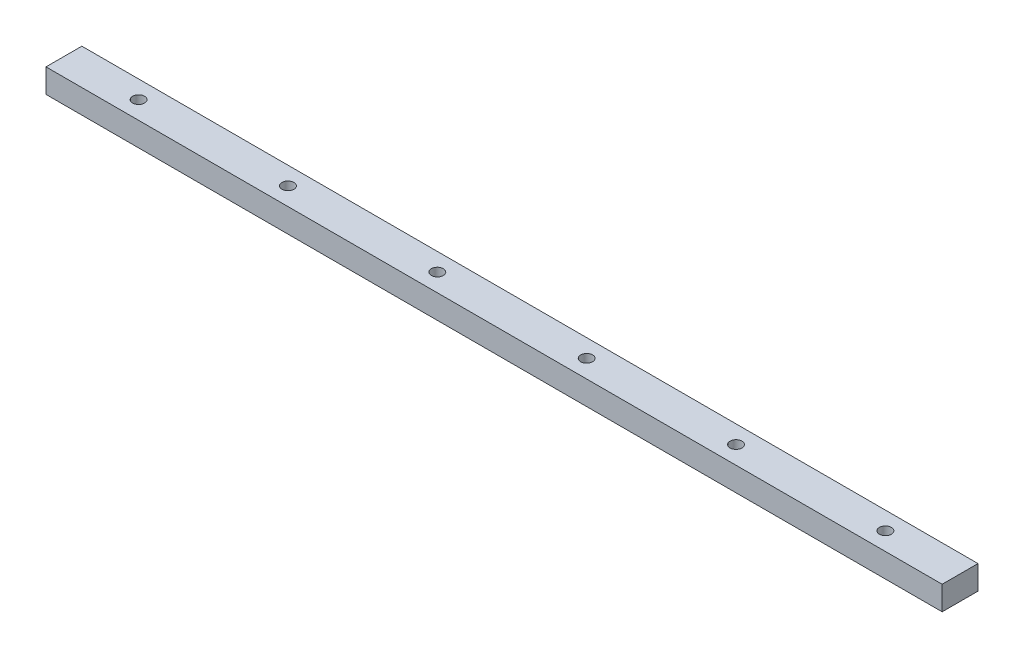
ISO-10303-21;
HEADER;
FILE_DESCRIPTION(('STEP AP214'),'2;1');
FILE_NAME('part.step','',(''),(''),'','','');
FILE_SCHEMA(('AUTOMOTIVE_DESIGN { 1 0 10303 214 1 1 1 1 }'));
ENDSEC;
DATA;
#1=APPLICATION_CONTEXT('core data for automotive mechanical design processes');
#2=APPLICATION_PROTOCOL_DEFINITION('international standard','automotive_design',2000,#1);
#3=PRODUCT_CONTEXT('',#1,'mechanical');
#4=PRODUCT('Part','Part','',(#3));
#5=PRODUCT_RELATED_PRODUCT_CATEGORY('part','',(#4));
#6=PRODUCT_DEFINITION_FORMATION('','',#4);
#7=PRODUCT_DEFINITION_CONTEXT('part definition',#1,'design');
#8=PRODUCT_DEFINITION('design','',#6,#7);
#9=PRODUCT_DEFINITION_SHAPE('','',#8);
#10=(LENGTH_UNIT() NAMED_UNIT(*) SI_UNIT(.MILLI.,.METRE.));
#11=(NAMED_UNIT(*) PLANE_ANGLE_UNIT() SI_UNIT($,.RADIAN.));
#12=(NAMED_UNIT(*) SI_UNIT($,.STERADIAN.) SOLID_ANGLE_UNIT());
#13=UNCERTAINTY_MEASURE_WITH_UNIT(LENGTH_MEASURE(1.E-05),#10,'distance_accuracy_value','');
#14=(GEOMETRIC_REPRESENTATION_CONTEXT(3) GLOBAL_UNCERTAINTY_ASSIGNED_CONTEXT((#13)) GLOBAL_UNIT_ASSIGNED_CONTEXT((#10,
#11,#12)) REPRESENTATION_CONTEXT('',''));
#15=CARTESIAN_POINT('',(0.,0.,0.));
#16=DIRECTION('',(0.,0.,1.));
#17=DIRECTION('',(1.,0.,0.));
#18=AXIS2_PLACEMENT_3D('',#15,#16,#17);
#19=CARTESIAN_POINT('',(0.,4.,0.));
#20=DIRECTION('',(0.,-1.,0.));
#21=DIRECTION('',(0.,0.,-1.));
#22=AXIS2_PLACEMENT_3D('',#19,#20,#21);
#23=PLANE('',#22);
#24=DIRECTION('',(0.,0.,-1.));
#25=VECTOR('',#24,1.);
#26=CARTESIAN_POINT('',(150.,4.,6.00000000000001));
#27=LINE('',#26,#25);
#28=CARTESIAN_POINT('',(150.,4.,6.00000000000001));
#29=VERTEX_POINT('',#28);
#30=CARTESIAN_POINT('',(150.,4.,-6.00000000000001));
#31=VERTEX_POINT('',#30);
#32=EDGE_CURVE('E98',#29,#31,#27,.T.);
#33=ORIENTED_EDGE('',*,*,#32,.T.);
#34=DIRECTION('',(-1.,0.,0.));
#35=VECTOR('',#34,1.);
#36=CARTESIAN_POINT('',(-150.,4.,-6.00000000000001));
#37=LINE('',#36,#35);
#38=CARTESIAN_POINT('',(-150.,4.,-6.00000000000001));
#39=VERTEX_POINT('',#38);
#40=EDGE_CURVE('E93',#31,#39,#37,.T.);
#41=ORIENTED_EDGE('',*,*,#40,.T.);
#42=DIRECTION('',(0.,0.,1.));
#43=VECTOR('',#42,1.);
#44=CARTESIAN_POINT('',(-150.,4.,6.00000000000001));
#45=LINE('',#44,#43);
#46=CARTESIAN_POINT('',(-150.,4.,6.00000000000001));
#47=VERTEX_POINT('',#46);
#48=EDGE_CURVE('E96',#39,#47,#45,.T.);
#49=ORIENTED_EDGE('',*,*,#48,.T.);
#50=DIRECTION('',(1.,0.,0.));
#51=VECTOR('',#50,1.);
#52=CARTESIAN_POINT('',(-150.,4.,6.00000000000001));
#53=LINE('',#52,#51);
#54=EDGE_CURVE('E63',#47,#29,#53,.T.);
#55=ORIENTED_EDGE('',*,*,#54,.T.);
#56=EDGE_LOOP('',(#33,#41,#49,#55));
#57=FACE_BOUND('',#56,.T.);
#58=CARTESIAN_POINT('',(-125.,4.,0.));
#59=DIRECTION('',(0.,1.,0.));
#60=DIRECTION('',(0.,0.,1.));
#61=AXIS2_PLACEMENT_3D('',#58,#59,#60);
#62=CIRCLE('',#61,2.);
#63=CARTESIAN_POINT('',(-125.,4.,2.));
#64=VERTEX_POINT('',#63);
#65=EDGE_CURVE('E118',#64,#64,#62,.T.);
#66=ORIENTED_EDGE('',*,*,#65,.F.);
#67=EDGE_LOOP('',(#66));
#68=FACE_BOUND('',#67,.T.);
#69=CARTESIAN_POINT('',(-75.,4.,0.));
#70=DIRECTION('',(0.,1.,0.));
#71=DIRECTION('',(0.,0.,1.));
#72=AXIS2_PLACEMENT_3D('',#69,#70,#71);
#73=CIRCLE('',#72,2.);
#74=CARTESIAN_POINT('',(-75.,4.,2.));
#75=VERTEX_POINT('',#74);
#76=EDGE_CURVE('E140',#75,#75,#73,.T.);
#77=ORIENTED_EDGE('',*,*,#76,.F.);
#78=EDGE_LOOP('',(#77));
#79=FACE_BOUND('',#78,.T.);
#80=CARTESIAN_POINT('',(-25.,4.,0.));
#81=DIRECTION('',(0.,1.,0.));
#82=DIRECTION('',(0.,0.,1.));
#83=AXIS2_PLACEMENT_3D('',#80,#81,#82);
#84=CIRCLE('',#83,2.);
#85=CARTESIAN_POINT('',(-25.,4.,2.));
#86=VERTEX_POINT('',#85);
#87=EDGE_CURVE('E148',#86,#86,#84,.T.);
#88=ORIENTED_EDGE('',*,*,#87,.F.);
#89=EDGE_LOOP('',(#88));
#90=FACE_BOUND('',#89,.T.);
#91=CARTESIAN_POINT('',(25.,4.,0.));
#92=DIRECTION('',(0.,1.,0.));
#93=DIRECTION('',(0.,0.,1.));
#94=AXIS2_PLACEMENT_3D('',#91,#92,#93);
#95=CIRCLE('',#94,2.);
#96=CARTESIAN_POINT('',(25.,4.,2.));
#97=VERTEX_POINT('',#96);
#98=EDGE_CURVE('E156',#97,#97,#95,.T.);
#99=ORIENTED_EDGE('',*,*,#98,.F.);
#100=EDGE_LOOP('',(#99));
#101=FACE_BOUND('',#100,.T.);
#102=CARTESIAN_POINT('',(75.,4.,0.));
#103=DIRECTION('',(0.,1.,0.));
#104=DIRECTION('',(0.,0.,1.));
#105=AXIS2_PLACEMENT_3D('',#102,#103,#104);
#106=CIRCLE('',#105,2.);
#107=CARTESIAN_POINT('',(75.,4.,2.));
#108=VERTEX_POINT('',#107);
#109=EDGE_CURVE('E164',#108,#108,#106,.T.);
#110=ORIENTED_EDGE('',*,*,#109,.F.);
#111=EDGE_LOOP('',(#110));
#112=FACE_BOUND('',#111,.T.);
#113=CARTESIAN_POINT('',(125.,4.,0.));
#114=DIRECTION('',(0.,1.,0.));
#115=DIRECTION('',(0.,0.,1.));
#116=AXIS2_PLACEMENT_3D('',#113,#114,#115);
#117=CIRCLE('',#116,2.);
#118=CARTESIAN_POINT('',(125.,4.,2.));
#119=VERTEX_POINT('',#118);
#120=EDGE_CURVE('E172',#119,#119,#117,.T.);
#121=ORIENTED_EDGE('',*,*,#120,.F.);
#122=EDGE_LOOP('',(#121));
#123=FACE_BOUND('',#122,.T.);
#124=ADVANCED_FACE('F45',(#57,#68,#79,#90,#101,#112,#123),#23,.F.);
#125=CARTESIAN_POINT('',(0.,-4.,0.));
#126=DIRECTION('',(0.,-1.,0.));
#127=DIRECTION('',(0.,0.,-1.));
#128=AXIS2_PLACEMENT_3D('',#125,#126,#127);
#129=PLANE('',#128);
#130=CARTESIAN_POINT('',(75.,-4.,0.));
#131=DIRECTION('',(0.,1.,0.));
#132=DIRECTION('',(0.,0.,1.));
#133=AXIS2_PLACEMENT_3D('',#130,#131,#132);
#134=CIRCLE('',#133,2.);
#135=CARTESIAN_POINT('',(75.,-4.,2.));
#136=VERTEX_POINT('',#135);
#137=EDGE_CURVE('E168',#136,#136,#134,.T.);
#138=ORIENTED_EDGE('',*,*,#137,.T.);
#139=EDGE_LOOP('',(#138));
#140=FACE_BOUND('',#139,.T.);
#141=CARTESIAN_POINT('',(-25.,-4.,0.));
#142=DIRECTION('',(0.,1.,0.));
#143=DIRECTION('',(0.,0.,1.));
#144=AXIS2_PLACEMENT_3D('',#141,#142,#143);
#145=CIRCLE('',#144,2.);
#146=CARTESIAN_POINT('',(-25.,-4.,2.));
#147=VERTEX_POINT('',#146);
#148=EDGE_CURVE('E152',#147,#147,#145,.T.);
#149=ORIENTED_EDGE('',*,*,#148,.T.);
#150=EDGE_LOOP('',(#149));
#151=FACE_BOUND('',#150,.T.);
#152=CARTESIAN_POINT('',(-125.,-4.,0.));
#153=DIRECTION('',(0.,1.,0.));
#154=DIRECTION('',(0.,0.,1.));
#155=AXIS2_PLACEMENT_3D('',#152,#153,#154);
#156=CIRCLE('',#155,2.);
#157=CARTESIAN_POINT('',(-125.,-4.,2.));
#158=VERTEX_POINT('',#157);
#159=EDGE_CURVE('E136',#158,#158,#156,.T.);
#160=ORIENTED_EDGE('',*,*,#159,.T.);
#161=EDGE_LOOP('',(#160));
#162=FACE_BOUND('',#161,.T.);
#163=DIRECTION('',(0.,0.,-1.));
#164=VECTOR('',#163,1.);
#165=CARTESIAN_POINT('',(150.,-4.,6.00000000000001));
#166=LINE('',#165,#164);
#167=CARTESIAN_POINT('',(150.,-4.,6.00000000000001));
#168=VERTEX_POINT('',#167);
#169=CARTESIAN_POINT('',(150.,-4.,-6.00000000000001));
#170=VERTEX_POINT('',#169);
#171=EDGE_CURVE('E114',#168,#170,#166,.T.);
#172=ORIENTED_EDGE('',*,*,#171,.F.);
#173=DIRECTION('',(1.,0.,0.));
#174=VECTOR('',#173,1.);
#175=CARTESIAN_POINT('',(-150.,-4.,6.00000000000001));
#176=LINE('',#175,#174);
#177=CARTESIAN_POINT('',(-150.,-4.,6.00000000000001));
#178=VERTEX_POINT('',#177);
#179=EDGE_CURVE('E86',#178,#168,#176,.T.);
#180=ORIENTED_EDGE('',*,*,#179,.F.);
#181=DIRECTION('',(0.,0.,1.));
#182=VECTOR('',#181,1.);
#183=CARTESIAN_POINT('',(-150.,-4.,6.00000000000001));
#184=LINE('',#183,#182);
#185=CARTESIAN_POINT('',(-150.,-4.,-6.00000000000001));
#186=VERTEX_POINT('',#185);
#187=EDGE_CURVE('E80',#186,#178,#184,.T.);
#188=ORIENTED_EDGE('',*,*,#187,.F.);
#189=DIRECTION('',(-1.,0.,0.));
#190=VECTOR('',#189,1.);
#191=CARTESIAN_POINT('',(-150.,-4.,-6.00000000000001));
#192=LINE('',#191,#190);
#193=EDGE_CURVE('E103',#170,#186,#192,.T.);
#194=ORIENTED_EDGE('',*,*,#193,.F.);
#195=EDGE_LOOP('',(#172,#180,#188,#194));
#196=FACE_BOUND('',#195,.T.);
#197=CARTESIAN_POINT('',(-75.,-4.,0.));
#198=DIRECTION('',(0.,1.,0.));
#199=DIRECTION('',(0.,0.,1.));
#200=AXIS2_PLACEMENT_3D('',#197,#198,#199);
#201=CIRCLE('',#200,2.);
#202=CARTESIAN_POINT('',(-75.,-4.,2.));
#203=VERTEX_POINT('',#202);
#204=EDGE_CURVE('E144',#203,#203,#201,.T.);
#205=ORIENTED_EDGE('',*,*,#204,.T.);
#206=EDGE_LOOP('',(#205));
#207=FACE_BOUND('',#206,.T.);
#208=CARTESIAN_POINT('',(25.,-4.,0.));
#209=DIRECTION('',(0.,1.,0.));
#210=DIRECTION('',(0.,0.,1.));
#211=AXIS2_PLACEMENT_3D('',#208,#209,#210);
#212=CIRCLE('',#211,2.);
#213=CARTESIAN_POINT('',(25.,-4.,2.));
#214=VERTEX_POINT('',#213);
#215=EDGE_CURVE('E160',#214,#214,#212,.T.);
#216=ORIENTED_EDGE('',*,*,#215,.T.);
#217=EDGE_LOOP('',(#216));
#218=FACE_BOUND('',#217,.T.);
#219=CARTESIAN_POINT('',(125.,-4.,0.));
#220=DIRECTION('',(0.,1.,0.));
#221=DIRECTION('',(0.,0.,1.));
#222=AXIS2_PLACEMENT_3D('',#219,#220,#221);
#223=CIRCLE('',#222,2.);
#224=CARTESIAN_POINT('',(125.,-4.,2.));
#225=VERTEX_POINT('',#224);
#226=EDGE_CURVE('E176',#225,#225,#223,.T.);
#227=ORIENTED_EDGE('',*,*,#226,.T.);
#228=EDGE_LOOP('',(#227));
#229=FACE_BOUND('',#228,.T.);
#230=ADVANCED_FACE('F131',(#140,#151,#162,#196,#207,#218,#229),#129,.T.);
#231=CARTESIAN_POINT('',(150.,4.,6.00000000000001));
#232=DIRECTION('',(-1.,0.,0.));
#233=DIRECTION('',(0.,0.,1.));
#234=AXIS2_PLACEMENT_3D('',#231,#232,#233);
#235=PLANE('',#234);
#236=ORIENTED_EDGE('',*,*,#171,.T.);
#237=DIRECTION('',(0.,-1.,0.));
#238=VECTOR('',#237,1.);
#239=CARTESIAN_POINT('',(150.,4.,-6.00000000000001));
#240=LINE('',#239,#238);
#241=EDGE_CURVE('E11',#31,#170,#240,.T.);
#242=ORIENTED_EDGE('',*,*,#241,.F.);
#243=ORIENTED_EDGE('',*,*,#32,.F.);
#244=DIRECTION('',(0.,-1.,0.));
#245=VECTOR('',#244,1.);
#246=CARTESIAN_POINT('',(150.,4.,6.00000000000001));
#247=LINE('',#246,#245);
#248=EDGE_CURVE('E110',#29,#168,#247,.T.);
#249=ORIENTED_EDGE('',*,*,#248,.T.);
#250=EDGE_LOOP('',(#236,#242,#243,#249));
#251=FACE_BOUND('',#250,.T.);
#252=ADVANCED_FACE('F47',(#251),#235,.F.);
#253=CARTESIAN_POINT('',(-150.,4.,-6.00000000000001));
#254=DIRECTION('',(0.,0.,1.));
#255=DIRECTION('',(1.,0.,0.));
#256=AXIS2_PLACEMENT_3D('',#253,#254,#255);
#257=PLANE('',#256);
#258=ORIENTED_EDGE('',*,*,#193,.T.);
#259=DIRECTION('',(0.,-1.,0.));
#260=VECTOR('',#259,1.);
#261=CARTESIAN_POINT('',(-150.,4.,-6.00000000000001));
#262=LINE('',#261,#260);
#263=EDGE_CURVE('E55',#39,#186,#262,.T.);
#264=ORIENTED_EDGE('',*,*,#263,.F.);
#265=ORIENTED_EDGE('',*,*,#40,.F.);
#266=ORIENTED_EDGE('',*,*,#241,.T.);
#267=EDGE_LOOP('',(#258,#264,#265,#266));
#268=FACE_BOUND('',#267,.T.);
#269=ADVANCED_FACE('F102',(#268),#257,.F.);
#270=CARTESIAN_POINT('',(-150.,4.,6.00000000000001));
#271=DIRECTION('',(1.,0.,0.));
#272=DIRECTION('',(0.,0.,-1.));
#273=AXIS2_PLACEMENT_3D('',#270,#271,#272);
#274=PLANE('',#273);
#275=ORIENTED_EDGE('',*,*,#187,.T.);
#276=DIRECTION('',(0.,-1.,0.));
#277=VECTOR('',#276,1.);
#278=CARTESIAN_POINT('',(-150.,4.,6.00000000000001));
#279=LINE('',#278,#277);
#280=EDGE_CURVE('E105',#47,#178,#279,.T.);
#281=ORIENTED_EDGE('',*,*,#280,.F.);
#282=ORIENTED_EDGE('',*,*,#48,.F.);
#283=ORIENTED_EDGE('',*,*,#263,.T.);
#284=EDGE_LOOP('',(#275,#281,#282,#283));
#285=FACE_BOUND('',#284,.T.);
#286=ADVANCED_FACE('F106',(#285),#274,.F.);
#287=CARTESIAN_POINT('',(-150.,4.,6.00000000000001));
#288=DIRECTION('',(0.,0.,-1.));
#289=DIRECTION('',(-1.,0.,0.));
#290=AXIS2_PLACEMENT_3D('',#287,#288,#289);
#291=PLANE('',#290);
#292=ORIENTED_EDGE('',*,*,#179,.T.);
#293=ORIENTED_EDGE('',*,*,#248,.F.);
#294=ORIENTED_EDGE('',*,*,#54,.F.);
#295=ORIENTED_EDGE('',*,*,#280,.T.);
#296=EDGE_LOOP('',(#292,#293,#294,#295));
#297=FACE_BOUND('',#296,.T.);
#298=ADVANCED_FACE('F128',(#297),#291,.F.);
#299=CARTESIAN_POINT('',(-125.,4.,0.));
#300=DIRECTION('',(0.,-1.,0.));
#301=DIRECTION('',(0.,0.,-1.));
#302=AXIS2_PLACEMENT_3D('',#299,#300,#301);
#303=CYLINDRICAL_SURFACE('',#302,2.);
#304=ORIENTED_EDGE('',*,*,#65,.T.);
#305=EDGE_LOOP('',(#304));
#306=FACE_BOUND('',#305,.T.);
#307=ORIENTED_EDGE('',*,*,#159,.F.);
#308=EDGE_LOOP('',(#307));
#309=FACE_BOUND('',#308,.T.);
#310=ADVANCED_FACE('F195',(#306,#309),#303,.F.);
#311=CARTESIAN_POINT('',(-75.,4.,0.));
#312=DIRECTION('',(0.,-1.,0.));
#313=DIRECTION('',(0.,0.,-1.));
#314=AXIS2_PLACEMENT_3D('',#311,#312,#313);
#315=CYLINDRICAL_SURFACE('',#314,2.);
#316=ORIENTED_EDGE('',*,*,#76,.T.);
#317=EDGE_LOOP('',(#316));
#318=FACE_BOUND('',#317,.T.);
#319=ORIENTED_EDGE('',*,*,#204,.F.);
#320=EDGE_LOOP('',(#319));
#321=FACE_BOUND('',#320,.T.);
#322=ADVANCED_FACE('F240',(#318,#321),#315,.F.);
#323=CARTESIAN_POINT('',(-25.,4.,0.));
#324=DIRECTION('',(0.,-1.,0.));
#325=DIRECTION('',(0.,0.,-1.));
#326=AXIS2_PLACEMENT_3D('',#323,#324,#325);
#327=CYLINDRICAL_SURFACE('',#326,2.);
#328=ORIENTED_EDGE('',*,*,#87,.T.);
#329=EDGE_LOOP('',(#328));
#330=FACE_BOUND('',#329,.T.);
#331=ORIENTED_EDGE('',*,*,#148,.F.);
#332=EDGE_LOOP('',(#331));
#333=FACE_BOUND('',#332,.T.);
#334=ADVANCED_FACE('F248',(#330,#333),#327,.F.);
#335=CARTESIAN_POINT('',(25.,4.,0.));
#336=DIRECTION('',(0.,-1.,0.));
#337=DIRECTION('',(0.,0.,-1.));
#338=AXIS2_PLACEMENT_3D('',#335,#336,#337);
#339=CYLINDRICAL_SURFACE('',#338,2.);
#340=ORIENTED_EDGE('',*,*,#98,.T.);
#341=EDGE_LOOP('',(#340));
#342=FACE_BOUND('',#341,.T.);
#343=ORIENTED_EDGE('',*,*,#215,.F.);
#344=EDGE_LOOP('',(#343));
#345=FACE_BOUND('',#344,.T.);
#346=ADVANCED_FACE('F256',(#342,#345),#339,.F.);
#347=CARTESIAN_POINT('',(75.,4.,0.));
#348=DIRECTION('',(0.,-1.,0.));
#349=DIRECTION('',(0.,0.,-1.));
#350=AXIS2_PLACEMENT_3D('',#347,#348,#349);
#351=CYLINDRICAL_SURFACE('',#350,2.);
#352=ORIENTED_EDGE('',*,*,#109,.T.);
#353=EDGE_LOOP('',(#352));
#354=FACE_BOUND('',#353,.T.);
#355=ORIENTED_EDGE('',*,*,#137,.F.);
#356=EDGE_LOOP('',(#355));
#357=FACE_BOUND('',#356,.T.);
#358=ADVANCED_FACE('F265',(#354,#357),#351,.F.);
#359=CARTESIAN_POINT('',(125.,4.,0.));
#360=DIRECTION('',(0.,-1.,0.));
#361=DIRECTION('',(0.,0.,-1.));
#362=AXIS2_PLACEMENT_3D('',#359,#360,#361);
#363=CYLINDRICAL_SURFACE('',#362,2.);
#364=ORIENTED_EDGE('',*,*,#120,.T.);
#365=EDGE_LOOP('',(#364));
#366=FACE_BOUND('',#365,.T.);
#367=ORIENTED_EDGE('',*,*,#226,.F.);
#368=EDGE_LOOP('',(#367));
#369=FACE_BOUND('',#368,.T.);
#370=ADVANCED_FACE('F184',(#366,#369),#363,.F.);
#371=CLOSED_SHELL('',(#124,#230,#252,#269,#286,#298,#310,#322,#334,#346,#358,#370));
#372=MANIFOLD_SOLID_BREP('B2',#371);
#373=ADVANCED_BREP_SHAPE_REPRESENTATION('',(#18,#372),#14);
#374=SHAPE_DEFINITION_REPRESENTATION(#9,#373);
ENDSEC;
END-ISO-10303-21;
